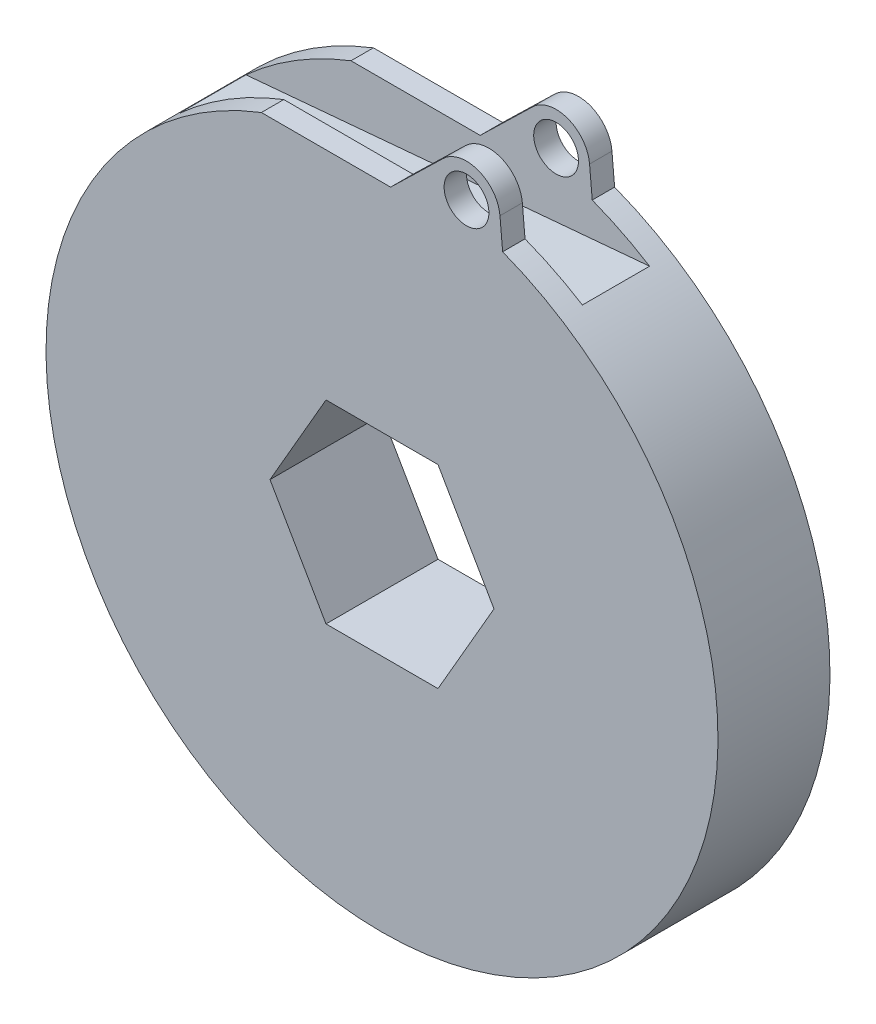
ISO-10303-21;
HEADER;
FILE_DESCRIPTION(('STEP AP214'),'2;1');
FILE_NAME('part.step','',(''),(''),'','','');
FILE_SCHEMA(('AUTOMOTIVE_DESIGN { 1 0 10303 214 1 1 1 1 }'));
ENDSEC;
DATA;
#1=APPLICATION_CONTEXT('core data for automotive mechanical design processes');
#2=APPLICATION_PROTOCOL_DEFINITION('international standard','automotive_design',2000,#1);
#3=PRODUCT_CONTEXT('',#1,'mechanical');
#4=PRODUCT('Part','Part','',(#3));
#5=PRODUCT_RELATED_PRODUCT_CATEGORY('part','',(#4));
#6=PRODUCT_DEFINITION_FORMATION('','',#4);
#7=PRODUCT_DEFINITION_CONTEXT('part definition',#1,'design');
#8=PRODUCT_DEFINITION('design','',#6,#7);
#9=PRODUCT_DEFINITION_SHAPE('','',#8);
#10=(LENGTH_UNIT() NAMED_UNIT(*) SI_UNIT(.MILLI.,.METRE.));
#11=(NAMED_UNIT(*) PLANE_ANGLE_UNIT() SI_UNIT($,.RADIAN.));
#12=(NAMED_UNIT(*) SI_UNIT($,.STERADIAN.) SOLID_ANGLE_UNIT());
#13=UNCERTAINTY_MEASURE_WITH_UNIT(LENGTH_MEASURE(1.E-05),#10,'distance_accuracy_value','');
#14=(GEOMETRIC_REPRESENTATION_CONTEXT(3) GLOBAL_UNCERTAINTY_ASSIGNED_CONTEXT((#13)) GLOBAL_UNIT_ASSIGNED_CONTEXT((#10,
#11,#12)) REPRESENTATION_CONTEXT('',''));
#15=CARTESIAN_POINT('',(0.,0.,0.));
#16=DIRECTION('',(0.,0.,1.));
#17=DIRECTION('',(1.,0.,0.));
#18=AXIS2_PLACEMENT_3D('',#15,#16,#17);
#19=CARTESIAN_POINT('',(-8.5865711114357,14.,-55.));
#20=DIRECTION('',(0.,-1.,0.));
#21=DIRECTION('',(0.,0.,-1.));
#22=AXIS2_PLACEMENT_3D('',#19,#20,#21);
#23=PLANE('',#22);
#24=DIRECTION('',(0.,0.,1.));
#25=VECTOR('',#24,1.);
#26=CARTESIAN_POINT('',(0.385164807134501,14.,-5.68242905807015));
#27=LINE('',#26,#25);
#28=CARTESIAN_POINT('',(0.385164807134501,14.,4.));
#29=VERTEX_POINT('',#28);
#30=CARTESIAN_POINT('',(0.385164807134501,14.,5.));
#31=VERTEX_POINT('',#30);
#32=EDGE_CURVE('E296',#29,#31,#27,.T.);
#33=ORIENTED_EDGE('',*,*,#32,.F.);
#34=DIRECTION('',(-1.,0.,0.));
#35=VECTOR('',#34,1.);
#36=CARTESIAN_POINT('',(-8.5865711114357,14.,4.));
#37=LINE('',#36,#35);
#38=CARTESIAN_POINT('',(-5.3851648071345,14.,4.));
#39=VERTEX_POINT('',#38);
#40=EDGE_CURVE('E271',#29,#39,#37,.T.);
#41=ORIENTED_EDGE('',*,*,#40,.T.);
#42=DIRECTION('',(0.,0.,-1.));
#43=VECTOR('',#42,1.);
#44=CARTESIAN_POINT('',(-5.38516480713451,14.,5.));
#45=LINE('',#44,#43);
#46=CARTESIAN_POINT('',(-5.3851648071345,14.,5.));
#47=VERTEX_POINT('',#46);
#48=EDGE_CURVE('E192',#47,#39,#45,.T.);
#49=ORIENTED_EDGE('',*,*,#48,.F.);
#50=DIRECTION('',(1.,0.,0.));
#51=VECTOR('',#50,1.);
#52=CARTESIAN_POINT('',(-8.5865711114357,14.,5.));
#53=LINE('',#52,#51);
#54=EDGE_CURVE('E184',#47,#31,#53,.T.);
#55=ORIENTED_EDGE('',*,*,#54,.T.);
#56=EDGE_LOOP('',(#33,#41,#49,#55));
#57=FACE_BOUND('',#56,.T.);
#58=ADVANCED_FACE('F33',(#57),#23,.F.);
#59=CARTESIAN_POINT('',(5.3851648071345,14.,-5.68242905807015));
#60=DIRECTION('',(0.996028320712149,0.0890369829864902,0.));
#61=DIRECTION('',(-0.0890369829864902,0.996028320712149,0.));
#62=AXIS2_PLACEMENT_3D('',#59,#60,#61);
#63=PLANE('',#62);
#64=DIRECTION('',(0.0890369829864898,-0.996028320712149,0.));
#65=VECTOR('',#64,1.);
#66=CARTESIAN_POINT('',(4.93637424818433,19.0204767927777,4.));
#67=LINE('',#66,#65);
#68=CARTESIAN_POINT('',(5.26595559026415,15.3335554744797,4.));
#69=VERTEX_POINT('',#68);
#70=CARTESIAN_POINT('',(5.38516480713451,14.,4.));
#71=VERTEX_POINT('',#70);
#72=EDGE_CURVE('E169',#69,#71,#67,.T.);
#73=ORIENTED_EDGE('',*,*,#72,.F.);
#74=DIRECTION('',(0.,0.,1.));
#75=VECTOR('',#74,1.);
#76=CARTESIAN_POINT('',(5.26595559026414,15.3335554744797,-5.68242905807015));
#77=LINE('',#76,#75);
#78=CARTESIAN_POINT('',(5.26595559026414,15.3335554744797,5.));
#79=VERTEX_POINT('',#78);
#80=EDGE_CURVE('E293',#69,#79,#77,.T.);
#81=ORIENTED_EDGE('',*,*,#80,.T.);
#82=DIRECTION('',(-0.0890369829864902,0.996028320712149,0.));
#83=VECTOR('',#82,1.);
#84=CARTESIAN_POINT('',(5.3851648071345,14.,5.));
#85=LINE('',#84,#83);
#86=CARTESIAN_POINT('',(5.3851648071345,14.,5.));
#87=VERTEX_POINT('',#86);
#88=EDGE_CURVE('E182',#87,#79,#85,.T.);
#89=ORIENTED_EDGE('',*,*,#88,.F.);
#90=DIRECTION('',(0.,0.,-1.));
#91=VECTOR('',#90,1.);
#92=CARTESIAN_POINT('',(5.38516480713451,14.,5.));
#93=LINE('',#92,#91);
#94=EDGE_CURVE('E163',#71,#87,#93,.F.);
#95=ORIENTED_EDGE('',*,*,#94,.F.);
#96=EDGE_LOOP('',(#73,#81,#89,#95));
#97=FACE_BOUND('',#96,.T.);
#98=ADVANCED_FACE('F180',(#97),#63,.T.);
#99=CARTESIAN_POINT('',(3.77191310919592,15.2,-5.68242905807015));
#100=DIRECTION('',(0.,0.,1.));
#101=DIRECTION('',(1.,0.,0.));
#102=AXIS2_PLACEMENT_3D('',#99,#100,#101);
#103=CYLINDRICAL_SURFACE('',#102,1.5);
#104=CARTESIAN_POINT('',(3.77191310919592,15.2,4.));
#105=DIRECTION('',(0.,0.,1.));
#106=DIRECTION('',(0.,-1.,0.));
#107=AXIS2_PLACEMENT_3D('',#104,#105,#106);
#108=CIRCLE('',#107,1.5);
#109=CARTESIAN_POINT('',(2.72643887666471,16.275631734895,4.));
#110=VERTEX_POINT('',#109);
#111=EDGE_CURVE('E175',#110,#69,#108,.F.);
#112=ORIENTED_EDGE('',*,*,#111,.F.);
#113=DIRECTION('',(0.,0.,1.));
#114=VECTOR('',#113,1.);
#115=CARTESIAN_POINT('',(2.72643887666471,16.275631734895,-5.68242905807015));
#116=LINE('',#115,#114);
#117=CARTESIAN_POINT('',(2.72643887666471,16.275631734895,5.));
#118=VERTEX_POINT('',#117);
#119=EDGE_CURVE('E300',#110,#118,#116,.T.);
#120=ORIENTED_EDGE('',*,*,#119,.T.);
#121=CARTESIAN_POINT('',(3.77191310919592,15.2,5.));
#122=DIRECTION('',(0.,0.,1.));
#123=DIRECTION('',(1.,0.,0.));
#124=AXIS2_PLACEMENT_3D('',#121,#122,#123);
#125=CIRCLE('',#124,1.5);
#126=EDGE_CURVE('E287',#79,#118,#125,.T.);
#127=ORIENTED_EDGE('',*,*,#126,.F.);
#128=ORIENTED_EDGE('',*,*,#80,.F.);
#129=EDGE_LOOP('',(#112,#120,#127,#128));
#130=FACE_BOUND('',#129,.T.);
#131=ADVANCED_FACE('F332',(#130),#103,.T.);
#132=CARTESIAN_POINT('',(2.72643887666471,16.275631734895,-5.68242905807015));
#133=DIRECTION('',(-0.696982821687471,0.717087823263351,0.));
#134=DIRECTION('',(-0.717087823263351,-0.696982821687471,0.));
#135=AXIS2_PLACEMENT_3D('',#132,#133,#134);
#136=PLANE('',#135);
#137=DIRECTION('',(0.717087823263351,0.696982821687471,0.));
#138=VECTOR('',#137,1.);
#139=CARTESIAN_POINT('',(2.72643887666471,16.275631734895,4.));
#140=LINE('',#139,#138);
#141=EDGE_CURVE('E257',#29,#110,#140,.T.);
#142=ORIENTED_EDGE('',*,*,#141,.F.);
#143=ORIENTED_EDGE('',*,*,#32,.T.);
#144=DIRECTION('',(-0.717087823263351,-0.696982821687471,0.));
#145=VECTOR('',#144,1.);
#146=CARTESIAN_POINT('',(2.72643887666471,16.275631734895,5.));
#147=LINE('',#146,#145);
#148=EDGE_CURVE('E290',#118,#31,#147,.T.);
#149=ORIENTED_EDGE('',*,*,#148,.F.);
#150=ORIENTED_EDGE('',*,*,#119,.F.);
#151=EDGE_LOOP('',(#142,#143,#149,#150));
#152=FACE_BOUND('',#151,.T.);
#153=ADVANCED_FACE('F370',(#152),#136,.T.);
#154=CARTESIAN_POINT('',(3.77191310919592,15.2,-5.68242905807015));
#155=DIRECTION('',(0.,0.,1.));
#156=DIRECTION('',(1.,0.,0.));
#157=AXIS2_PLACEMENT_3D('',#154,#155,#156);
#158=CYLINDRICAL_SURFACE('',#157,1.);
#159=CARTESIAN_POINT('',(3.77191310919592,15.2,4.));
#160=DIRECTION('',(0.,0.,1.));
#161=DIRECTION('',(0.,-1.,0.));
#162=AXIS2_PLACEMENT_3D('',#159,#160,#161);
#163=CIRCLE('',#162,1.);
#164=CARTESIAN_POINT('',(3.77191310919592,14.2,4.));
#165=VERTEX_POINT('',#164);
#166=EDGE_CURVE('E255',#165,#165,#163,.F.);
#167=ORIENTED_EDGE('',*,*,#166,.T.);
#168=EDGE_LOOP('',(#167));
#169=FACE_BOUND('',#168,.T.);
#170=CARTESIAN_POINT('',(3.77191310919592,15.2,5.));
#171=DIRECTION('',(0.,0.,1.));
#172=DIRECTION('',(1.,0.,0.));
#173=AXIS2_PLACEMENT_3D('',#170,#171,#172);
#174=CIRCLE('',#173,1.);
#175=CARTESIAN_POINT('',(4.77191310919592,15.2,5.));
#176=VERTEX_POINT('',#175);
#177=EDGE_CURVE('E276',#176,#176,#174,.T.);
#178=ORIENTED_EDGE('',*,*,#177,.T.);
#179=EDGE_LOOP('',(#178));
#180=FACE_BOUND('',#179,.T.);
#181=ADVANCED_FACE('F380',(#169,#180),#158,.F.);
#182=CARTESIAN_POINT('',(0.,0.,5.));
#183=DIRECTION('',(0.,0.,-1.));
#184=DIRECTION('',(-1.,0.,0.));
#185=AXIS2_PLACEMENT_3D('',#182,#183,#184);
#186=CYLINDRICAL_SURFACE('',#185,15.);
#187=CARTESIAN_POINT('',(0.,0.,3.99999999999999));
#188=DIRECTION('',(0.,0.,1.));
#189=DIRECTION('',(0.,-1.,0.));
#190=AXIS2_PLACEMENT_3D('',#187,#188,#189);
#191=CIRCLE('',#190,15.);
#192=CARTESIAN_POINT('',(-10.0759775223483,11.1119159900141,4.));
#193=VERTEX_POINT('',#192);
#194=EDGE_CURVE('E274',#39,#193,#191,.T.);
#195=ORIENTED_EDGE('',*,*,#194,.T.);
#196=DIRECTION('',(0.,0.,-1.));
#197=VECTOR('',#196,1.);
#198=CARTESIAN_POINT('',(-10.0759775223483,11.1119159900141,5.));
#199=LINE('',#198,#197);
#200=CARTESIAN_POINT('',(-10.0759775223483,11.1119159900141,0.999999999999999));
#201=VERTEX_POINT('',#200);
#202=EDGE_CURVE('E11',#193,#201,#199,.T.);
#203=ORIENTED_EDGE('',*,*,#202,.T.);
#204=CARTESIAN_POINT('',(0.,0.,0.999999999999997));
#205=DIRECTION('',(0.,0.,-1.));
#206=DIRECTION('',(0.,1.,0.));
#207=AXIS2_PLACEMENT_3D('',#204,#205,#206);
#208=CIRCLE('',#207,15.);
#209=CARTESIAN_POINT('',(-5.3851648071345,14.,1.));
#210=VERTEX_POINT('',#209);
#211=EDGE_CURVE('E258',#201,#210,#208,.T.);
#212=ORIENTED_EDGE('',*,*,#211,.T.);
#213=CARTESIAN_POINT('',(-5.3851648071345,14.,0.));
#214=VERTEX_POINT('',#213);
#215=EDGE_CURVE('E186',#210,#214,#45,.T.);
#216=ORIENTED_EDGE('',*,*,#215,.T.);
#217=CARTESIAN_POINT('',(0.,0.,0.));
#218=DIRECTION('',(0.,0.,1.));
#219=DIRECTION('',(1.,0.,0.));
#220=AXIS2_PLACEMENT_3D('',#217,#218,#219);
#221=CIRCLE('',#220,15.);
#222=CARTESIAN_POINT('',(5.3851648071345,14.,0.));
#223=VERTEX_POINT('',#222);
#224=EDGE_CURVE('E215',#214,#223,#221,.T.);
#225=ORIENTED_EDGE('',*,*,#224,.T.);
#226=CARTESIAN_POINT('',(5.38516480713451,14.,0.999999999999999));
#227=VERTEX_POINT('',#226);
#228=EDGE_CURVE('E56',#223,#227,#93,.F.);
#229=ORIENTED_EDGE('',*,*,#228,.T.);
#230=CARTESIAN_POINT('',(0.,0.,0.999999999999999));
#231=DIRECTION('',(0.,0.,-1.));
#232=DIRECTION('',(-1.,0.,0.));
#233=AXIS2_PLACEMENT_3D('',#230,#231,#232);
#234=CIRCLE('',#233,15.);
#235=CARTESIAN_POINT('',(7.94533718161869,12.7228777039783,0.999999999999999));
#236=VERTEX_POINT('',#235);
#237=EDGE_CURVE('E170',#227,#236,#234,.T.);
#238=ORIENTED_EDGE('',*,*,#237,.T.);
#239=DIRECTION('',(0.,0.,-1.));
#240=VECTOR('',#239,1.);
#241=CARTESIAN_POINT('',(7.9453371816187,12.7228777039783,5.));
#242=LINE('',#241,#240);
#243=CARTESIAN_POINT('',(7.94533718161869,12.7228777039783,4.));
#244=VERTEX_POINT('',#243);
#245=EDGE_CURVE('E41',#236,#244,#242,.F.);
#246=ORIENTED_EDGE('',*,*,#245,.T.);
#247=CARTESIAN_POINT('',(0.,0.,4.));
#248=DIRECTION('',(0.,0.,1.));
#249=DIRECTION('',(1.,0.,0.));
#250=AXIS2_PLACEMENT_3D('',#247,#248,#249);
#251=CIRCLE('',#250,15.);
#252=EDGE_CURVE('E159',#244,#71,#251,.T.);
#253=ORIENTED_EDGE('',*,*,#252,.T.);
#254=ORIENTED_EDGE('',*,*,#94,.T.);
#255=CARTESIAN_POINT('',(0.,0.,5.));
#256=DIRECTION('',(0.,0.,1.));
#257=DIRECTION('',(1.,0.,0.));
#258=AXIS2_PLACEMENT_3D('',#255,#256,#257);
#259=CIRCLE('',#258,15.);
#260=EDGE_CURVE('E226',#47,#87,#259,.T.);
#261=ORIENTED_EDGE('',*,*,#260,.F.);
#262=ORIENTED_EDGE('',*,*,#48,.T.);
#263=EDGE_LOOP('',(#195,#203,#212,#216,#225,#229,#238,#246,#253,#254,#261,#262));
#264=FACE_BOUND('',#263,.T.);
#265=ADVANCED_FACE('F35',(#264),#186,.T.);
#266=CARTESIAN_POINT('',(0.,0.,5.));
#267=DIRECTION('',(0.,0.,1.));
#268=DIRECTION('',(1.,0.,0.));
#269=AXIS2_PLACEMENT_3D('',#266,#267,#268);
#270=PLANE('',#269);
#271=ORIENTED_EDGE('',*,*,#54,.F.);
#272=ORIENTED_EDGE('',*,*,#260,.T.);
#273=ORIENTED_EDGE('',*,*,#88,.T.);
#274=ORIENTED_EDGE('',*,*,#126,.T.);
#275=ORIENTED_EDGE('',*,*,#148,.T.);
#276=EDGE_LOOP('',(#271,#272,#273,#274,#275));
#277=FACE_BOUND('',#276,.T.);
#278=DIRECTION('',(0.500000000000001,-0.866025403784438,0.));
#279=VECTOR('',#278,1.);
#280=CARTESIAN_POINT('',(-5.,0.,5.));
#281=LINE('',#280,#279);
#282=CARTESIAN_POINT('',(-5.,0.,5.));
#283=VERTEX_POINT('',#282);
#284=CARTESIAN_POINT('',(-2.5,-4.33012701892219,5.));
#285=VERTEX_POINT('',#284);
#286=EDGE_CURVE('E195',#283,#285,#281,.T.);
#287=ORIENTED_EDGE('',*,*,#286,.F.);
#288=DIRECTION('',(-0.5,-0.866025403784439,0.));
#289=VECTOR('',#288,1.);
#290=CARTESIAN_POINT('',(-2.5,4.33012701892219,5.));
#291=LINE('',#290,#289);
#292=CARTESIAN_POINT('',(-2.5,4.33012701892219,5.));
#293=VERTEX_POINT('',#292);
#294=EDGE_CURVE('E209',#293,#283,#291,.T.);
#295=ORIENTED_EDGE('',*,*,#294,.F.);
#296=DIRECTION('',(-1.,0.,0.));
#297=VECTOR('',#296,1.);
#298=CARTESIAN_POINT('',(2.5,4.3301270189222,5.));
#299=LINE('',#298,#297);
#300=CARTESIAN_POINT('',(2.5,4.3301270189222,5.));
#301=VERTEX_POINT('',#300);
#302=EDGE_CURVE('E206',#301,#293,#299,.T.);
#303=ORIENTED_EDGE('',*,*,#302,.F.);
#304=DIRECTION('',(-0.5,0.866025403784439,0.));
#305=VECTOR('',#304,1.);
#306=CARTESIAN_POINT('',(5.,0.,5.));
#307=LINE('',#306,#305);
#308=CARTESIAN_POINT('',(5.,0.,5.));
#309=VERTEX_POINT('',#308);
#310=EDGE_CURVE('E203',#309,#301,#307,.T.);
#311=ORIENTED_EDGE('',*,*,#310,.F.);
#312=DIRECTION('',(0.5,0.866025403784439,0.));
#313=VECTOR('',#312,1.);
#314=CARTESIAN_POINT('',(2.5,-4.33012701892219,5.));
#315=LINE('',#314,#313);
#316=CARTESIAN_POINT('',(2.5,-4.33012701892219,5.));
#317=VERTEX_POINT('',#316);
#318=EDGE_CURVE('E200',#317,#309,#315,.T.);
#319=ORIENTED_EDGE('',*,*,#318,.F.);
#320=DIRECTION('',(1.,0.,0.));
#321=VECTOR('',#320,1.);
#322=CARTESIAN_POINT('',(-2.5,-4.33012701892219,5.));
#323=LINE('',#322,#321);
#324=EDGE_CURVE('E197',#285,#317,#323,.T.);
#325=ORIENTED_EDGE('',*,*,#324,.F.);
#326=EDGE_LOOP('',(#287,#295,#303,#311,#319,#325));
#327=FACE_BOUND('',#326,.T.);
#328=ORIENTED_EDGE('',*,*,#177,.F.);
#329=EDGE_LOOP('',(#328));
#330=FACE_BOUND('',#329,.T.);
#331=ADVANCED_FACE('F311',(#277,#327,#330),#270,.T.);
#332=CARTESIAN_POINT('',(0.,0.,0.));
#333=DIRECTION('',(0.,0.,1.));
#334=DIRECTION('',(1.,0.,0.));
#335=AXIS2_PLACEMENT_3D('',#332,#333,#334);
#336=PLANE('',#335);
#337=DIRECTION('',(-0.5,-0.866025403784439,0.));
#338=VECTOR('',#337,1.);
#339=CARTESIAN_POINT('',(-3.75,2.1650635094611,0.));
#340=LINE('',#339,#338);
#341=CARTESIAN_POINT('',(-2.5,4.33012701892219,0.));
#342=VERTEX_POINT('',#341);
#343=CARTESIAN_POINT('',(-5.,0.,0.));
#344=VERTEX_POINT('',#343);
#345=EDGE_CURVE('E242',#342,#344,#340,.T.);
#346=ORIENTED_EDGE('',*,*,#345,.T.);
#347=DIRECTION('',(0.500000000000001,-0.866025403784438,0.));
#348=VECTOR('',#347,1.);
#349=CARTESIAN_POINT('',(-3.75,-2.1650635094611,0.));
#350=LINE('',#349,#348);
#351=CARTESIAN_POINT('',(-2.5,-4.33012701892219,0.));
#352=VERTEX_POINT('',#351);
#353=EDGE_CURVE('E245',#344,#352,#350,.T.);
#354=ORIENTED_EDGE('',*,*,#353,.T.);
#355=DIRECTION('',(1.,0.,0.));
#356=VECTOR('',#355,1.);
#357=CARTESIAN_POINT('',(0.,-4.33012701892219,0.));
#358=LINE('',#357,#356);
#359=CARTESIAN_POINT('',(2.5,-4.33012701892219,0.));
#360=VERTEX_POINT('',#359);
#361=EDGE_CURVE('E228',#352,#360,#358,.T.);
#362=ORIENTED_EDGE('',*,*,#361,.T.);
#363=DIRECTION('',(0.5,0.866025403784439,0.));
#364=VECTOR('',#363,1.);
#365=CARTESIAN_POINT('',(3.75,-2.16506350946109,0.));
#366=LINE('',#365,#364);
#367=CARTESIAN_POINT('',(5.,0.,0.));
#368=VERTEX_POINT('',#367);
#369=EDGE_CURVE('E233',#360,#368,#366,.T.);
#370=ORIENTED_EDGE('',*,*,#369,.T.);
#371=DIRECTION('',(-0.5,0.866025403784439,0.));
#372=VECTOR('',#371,1.);
#373=CARTESIAN_POINT('',(3.75,2.1650635094611,0.));
#374=LINE('',#373,#372);
#375=CARTESIAN_POINT('',(2.5,4.3301270189222,0.));
#376=VERTEX_POINT('',#375);
#377=EDGE_CURVE('E236',#368,#376,#374,.T.);
#378=ORIENTED_EDGE('',*,*,#377,.T.);
#379=DIRECTION('',(-1.,0.,0.));
#380=VECTOR('',#379,1.);
#381=CARTESIAN_POINT('',(0.,4.3301270189222,0.));
#382=LINE('',#381,#380);
#383=EDGE_CURVE('E239',#376,#342,#382,.T.);
#384=ORIENTED_EDGE('',*,*,#383,.T.);
#385=EDGE_LOOP('',(#346,#354,#362,#370,#378,#384));
#386=FACE_BOUND('',#385,.T.);
#387=ORIENTED_EDGE('',*,*,#224,.F.);
#388=DIRECTION('',(1.,0.,0.));
#389=VECTOR('',#388,1.);
#390=CARTESIAN_POINT('',(0.,14.,0.));
#391=LINE('',#390,#389);
#392=CARTESIAN_POINT('',(0.385164807134501,14.,0.));
#393=VERTEX_POINT('',#392);
#394=EDGE_CURVE('E248',#214,#393,#391,.T.);
#395=ORIENTED_EDGE('',*,*,#394,.T.);
#396=DIRECTION('',(0.717087823263351,0.696982821687471,0.));
#397=VECTOR('',#396,1.);
#398=CARTESIAN_POINT('',(2.72643887666471,16.275631734895,0.));
#399=LINE('',#398,#397);
#400=CARTESIAN_POINT('',(2.72643887666471,16.275631734895,0.));
#401=VERTEX_POINT('',#400);
#402=EDGE_CURVE('E279',#393,#401,#399,.T.);
#403=ORIENTED_EDGE('',*,*,#402,.T.);
#404=CARTESIAN_POINT('',(3.77191310919592,15.2,0.));
#405=DIRECTION('',(0.,0.,1.));
#406=DIRECTION('',(1.,0.,0.));
#407=AXIS2_PLACEMENT_3D('',#404,#405,#406);
#408=CIRCLE('',#407,1.5);
#409=CARTESIAN_POINT('',(5.26595559026414,15.3335554744797,0.));
#410=VERTEX_POINT('',#409);
#411=EDGE_CURVE('E280',#401,#410,#408,.F.);
#412=ORIENTED_EDGE('',*,*,#411,.T.);
#413=DIRECTION('',(0.0890369829864902,-0.996028320712149,0.));
#414=VECTOR('',#413,1.);
#415=CARTESIAN_POINT('',(5.3851648071345,14.,0.));
#416=LINE('',#415,#414);
#417=EDGE_CURVE('E277',#410,#223,#416,.T.);
#418=ORIENTED_EDGE('',*,*,#417,.T.);
#419=EDGE_LOOP('',(#387,#395,#403,#412,#418));
#420=FACE_BOUND('',#419,.T.);
#421=CARTESIAN_POINT('',(3.77191310919592,15.2,0.));
#422=DIRECTION('',(0.,0.,1.));
#423=DIRECTION('',(1.,0.,0.));
#424=AXIS2_PLACEMENT_3D('',#421,#422,#423);
#425=CIRCLE('',#424,1.);
#426=CARTESIAN_POINT('',(4.77191310919592,15.2,0.));
#427=VERTEX_POINT('',#426);
#428=EDGE_CURVE('E188',#427,#427,#425,.F.);
#429=ORIENTED_EDGE('',*,*,#428,.F.);
#430=EDGE_LOOP('',(#429));
#431=FACE_BOUND('',#430,.T.);
#432=ADVANCED_FACE('F308',(#386,#420,#431),#336,.F.);
#433=CARTESIAN_POINT('',(-5.,0.,-25.));
#434=DIRECTION('',(-0.866025403784438,-0.500000000000001,0.));
#435=DIRECTION('',(0.500000000000001,-0.866025403784438,0.));
#436=AXIS2_PLACEMENT_3D('',#433,#434,#435);
#437=PLANE('',#436);
#438=DIRECTION('',(0.,0.,1.));
#439=VECTOR('',#438,1.);
#440=CARTESIAN_POINT('',(-5.,0.,-25.));
#441=LINE('',#440,#439);
#442=EDGE_CURVE('E213',#344,#283,#441,.T.);
#443=ORIENTED_EDGE('',*,*,#442,.T.);
#444=ORIENTED_EDGE('',*,*,#286,.T.);
#445=DIRECTION('',(0.,0.,1.));
#446=VECTOR('',#445,1.);
#447=CARTESIAN_POINT('',(-2.5,-4.33012701892219,-25.));
#448=LINE('',#447,#446);
#449=EDGE_CURVE('E212',#352,#285,#448,.T.);
#450=ORIENTED_EDGE('',*,*,#449,.F.);
#451=ORIENTED_EDGE('',*,*,#353,.F.);
#452=EDGE_LOOP('',(#443,#444,#450,#451));
#453=FACE_BOUND('',#452,.T.);
#454=ADVANCED_FACE('F310',(#453),#437,.F.);
#455=CARTESIAN_POINT('',(-2.5,4.33012701892219,-25.));
#456=DIRECTION('',(-0.866025403784439,0.5,0.));
#457=DIRECTION('',(-0.5,-0.866025403784439,0.));
#458=AXIS2_PLACEMENT_3D('',#455,#456,#457);
#459=PLANE('',#458);
#460=DIRECTION('',(0.,0.,1.));
#461=VECTOR('',#460,1.);
#462=CARTESIAN_POINT('',(-2.5,4.33012701892219,-25.));
#463=LINE('',#462,#461);
#464=EDGE_CURVE('E216',#342,#293,#463,.T.);
#465=ORIENTED_EDGE('',*,*,#464,.T.);
#466=ORIENTED_EDGE('',*,*,#294,.T.);
#467=ORIENTED_EDGE('',*,*,#442,.F.);
#468=ORIENTED_EDGE('',*,*,#345,.F.);
#469=EDGE_LOOP('',(#465,#466,#467,#468));
#470=FACE_BOUND('',#469,.T.);
#471=ADVANCED_FACE('F318',(#470),#459,.F.);
#472=CARTESIAN_POINT('',(2.5,4.3301270189222,-25.));
#473=DIRECTION('',(0.,1.,0.));
#474=DIRECTION('',(-1.,0.,0.));
#475=AXIS2_PLACEMENT_3D('',#472,#473,#474);
#476=PLANE('',#475);
#477=DIRECTION('',(0.,0.,1.));
#478=VECTOR('',#477,1.);
#479=CARTESIAN_POINT('',(2.5,4.3301270189222,-25.));
#480=LINE('',#479,#478);
#481=EDGE_CURVE('E218',#376,#301,#480,.T.);
#482=ORIENTED_EDGE('',*,*,#481,.T.);
#483=ORIENTED_EDGE('',*,*,#302,.T.);
#484=ORIENTED_EDGE('',*,*,#464,.F.);
#485=ORIENTED_EDGE('',*,*,#383,.F.);
#486=EDGE_LOOP('',(#482,#483,#484,#485));
#487=FACE_BOUND('',#486,.T.);
#488=ADVANCED_FACE('F503',(#487),#476,.F.);
#489=CARTESIAN_POINT('',(5.,0.,-25.));
#490=DIRECTION('',(0.866025403784439,0.5,0.));
#491=DIRECTION('',(-0.5,0.866025403784439,0.));
#492=AXIS2_PLACEMENT_3D('',#489,#490,#491);
#493=PLANE('',#492);
#494=DIRECTION('',(0.,0.,1.));
#495=VECTOR('',#494,1.);
#496=CARTESIAN_POINT('',(5.,0.,-25.));
#497=LINE('',#496,#495);
#498=EDGE_CURVE('E220',#368,#309,#497,.T.);
#499=ORIENTED_EDGE('',*,*,#498,.T.);
#500=ORIENTED_EDGE('',*,*,#310,.T.);
#501=ORIENTED_EDGE('',*,*,#481,.F.);
#502=ORIENTED_EDGE('',*,*,#377,.F.);
#503=EDGE_LOOP('',(#499,#500,#501,#502));
#504=FACE_BOUND('',#503,.T.);
#505=ADVANCED_FACE('F493',(#504),#493,.F.);
#506=CARTESIAN_POINT('',(2.5,-4.33012701892219,-25.));
#507=DIRECTION('',(0.866025403784439,-0.499999999999999,0.));
#508=DIRECTION('',(0.5,0.866025403784439,0.));
#509=AXIS2_PLACEMENT_3D('',#506,#507,#508);
#510=PLANE('',#509);
#511=DIRECTION('',(0.,0.,1.));
#512=VECTOR('',#511,1.);
#513=CARTESIAN_POINT('',(2.5,-4.33012701892219,-25.));
#514=LINE('',#513,#512);
#515=EDGE_CURVE('E222',#360,#317,#514,.T.);
#516=ORIENTED_EDGE('',*,*,#515,.T.);
#517=ORIENTED_EDGE('',*,*,#318,.T.);
#518=ORIENTED_EDGE('',*,*,#498,.F.);
#519=ORIENTED_EDGE('',*,*,#369,.F.);
#520=EDGE_LOOP('',(#516,#517,#518,#519));
#521=FACE_BOUND('',#520,.T.);
#522=ADVANCED_FACE('F343',(#521),#510,.F.);
#523=CARTESIAN_POINT('',(-2.5,-4.33012701892219,-25.));
#524=DIRECTION('',(0.,-1.,0.));
#525=DIRECTION('',(0.,0.,-1.));
#526=AXIS2_PLACEMENT_3D('',#523,#524,#525);
#527=PLANE('',#526);
#528=ORIENTED_EDGE('',*,*,#449,.T.);
#529=ORIENTED_EDGE('',*,*,#324,.T.);
#530=ORIENTED_EDGE('',*,*,#515,.F.);
#531=ORIENTED_EDGE('',*,*,#361,.F.);
#532=EDGE_LOOP('',(#528,#529,#530,#531));
#533=FACE_BOUND('',#532,.T.);
#534=ADVANCED_FACE('F337',(#533),#527,.F.);
#535=ORIENTED_EDGE('',*,*,#215,.F.);
#536=DIRECTION('',(1.,0.,0.));
#537=VECTOR('',#536,1.);
#538=CARTESIAN_POINT('',(-8.5865711114357,14.,1.));
#539=LINE('',#538,#537);
#540=CARTESIAN_POINT('',(0.385164807134501,14.,1.));
#541=VERTEX_POINT('',#540);
#542=EDGE_CURVE('E263',#210,#541,#539,.T.);
#543=ORIENTED_EDGE('',*,*,#542,.T.);
#544=EDGE_CURVE('E282',#393,#541,#27,.T.);
#545=ORIENTED_EDGE('',*,*,#544,.F.);
#546=ORIENTED_EDGE('',*,*,#394,.F.);
#547=EDGE_LOOP('',(#535,#543,#545,#546));
#548=FACE_BOUND('',#547,.T.);
#549=ADVANCED_FACE('F327',(#548),#23,.F.);
#550=DIRECTION('',(-0.0890369829864898,0.996028320712149,0.));
#551=VECTOR('',#550,1.);
#552=CARTESIAN_POINT('',(4.93637424818433,19.0204767927777,1.));
#553=LINE('',#552,#551);
#554=CARTESIAN_POINT('',(5.26595559026415,15.3335554744797,1.));
#555=VERTEX_POINT('',#554);
#556=EDGE_CURVE('E178',#227,#555,#553,.T.);
#557=ORIENTED_EDGE('',*,*,#556,.F.);
#558=ORIENTED_EDGE('',*,*,#228,.F.);
#559=ORIENTED_EDGE('',*,*,#417,.F.);
#560=EDGE_CURVE('E301',#410,#555,#77,.T.);
#561=ORIENTED_EDGE('',*,*,#560,.T.);
#562=EDGE_LOOP('',(#557,#558,#559,#561));
#563=FACE_BOUND('',#562,.T.);
#564=ADVANCED_FACE('F334',(#563),#63,.T.);
#565=CARTESIAN_POINT('',(3.77191310919592,15.2,0.999999999999999));
#566=DIRECTION('',(0.,0.,-1.));
#567=DIRECTION('',(0.,1.,0.));
#568=AXIS2_PLACEMENT_3D('',#565,#566,#567);
#569=CIRCLE('',#568,1.5);
#570=CARTESIAN_POINT('',(2.72643887666471,16.275631734895,1.));
#571=VERTEX_POINT('',#570);
#572=EDGE_CURVE('E48',#555,#571,#569,.F.);
#573=ORIENTED_EDGE('',*,*,#572,.F.);
#574=ORIENTED_EDGE('',*,*,#560,.F.);
#575=ORIENTED_EDGE('',*,*,#411,.F.);
#576=EDGE_CURVE('E297',#401,#571,#116,.T.);
#577=ORIENTED_EDGE('',*,*,#576,.T.);
#578=EDGE_LOOP('',(#573,#574,#575,#577));
#579=FACE_BOUND('',#578,.T.);
#580=ADVANCED_FACE('F342',(#579),#103,.T.);
#581=DIRECTION('',(-0.717087823263351,-0.696982821687471,0.));
#582=VECTOR('',#581,1.);
#583=CARTESIAN_POINT('',(2.72643887666471,16.275631734895,1.));
#584=LINE('',#583,#582);
#585=EDGE_CURVE('E254',#571,#541,#584,.T.);
#586=ORIENTED_EDGE('',*,*,#585,.F.);
#587=ORIENTED_EDGE('',*,*,#576,.F.);
#588=ORIENTED_EDGE('',*,*,#402,.F.);
#589=ORIENTED_EDGE('',*,*,#544,.T.);
#590=EDGE_LOOP('',(#586,#587,#588,#589));
#591=FACE_BOUND('',#590,.T.);
#592=ADVANCED_FACE('F382',(#591),#136,.T.);
#593=CARTESIAN_POINT('',(3.77191310919592,15.2,0.999999999999999));
#594=DIRECTION('',(0.,0.,-1.));
#595=DIRECTION('',(0.,1.,0.));
#596=AXIS2_PLACEMENT_3D('',#593,#594,#595);
#597=CIRCLE('',#596,1.);
#598=CARTESIAN_POINT('',(3.77191310919592,16.2,0.999999999999999));
#599=VERTEX_POINT('',#598);
#600=EDGE_CURVE('E251',#599,#599,#597,.F.);
#601=ORIENTED_EDGE('',*,*,#600,.T.);
#602=EDGE_LOOP('',(#601));
#603=FACE_BOUND('',#602,.T.);
#604=ORIENTED_EDGE('',*,*,#428,.T.);
#605=EDGE_LOOP('',(#604));
#606=FACE_BOUND('',#605,.T.);
#607=ADVANCED_FACE('F306',(#603,#606),#158,.F.);
#608=CARTESIAN_POINT('',(-17.8590027883843,16.9827520060724,4.));
#609=DIRECTION('',(0.,0.,1.));
#610=DIRECTION('',(0.,-1.,0.));
#611=AXIS2_PLACEMENT_3D('',#608,#609,#610);
#612=PLANE('',#611);
#613=ORIENTED_EDGE('',*,*,#166,.F.);
#614=EDGE_LOOP('',(#613));
#615=FACE_BOUND('',#614,.T.);
#616=ORIENTED_EDGE('',*,*,#40,.F.);
#617=ORIENTED_EDGE('',*,*,#141,.T.);
#618=ORIENTED_EDGE('',*,*,#111,.T.);
#619=ORIENTED_EDGE('',*,*,#72,.T.);
#620=ORIENTED_EDGE('',*,*,#252,.F.);
#621=DIRECTION('',(0.996028320712149,0.0890369829864902,0.));
#622=VECTOR('',#621,1.);
#623=CARTESIAN_POINT('',(-17.2766567549544,10.4682327322265,4.));
#624=LINE('',#623,#622);
#625=EDGE_CURVE('E358',#193,#244,#624,.T.);
#626=ORIENTED_EDGE('',*,*,#625,.F.);
#627=ORIENTED_EDGE('',*,*,#194,.F.);
#628=EDGE_LOOP('',(#616,#617,#618,#619,#620,#626,#627));
#629=FACE_BOUND('',#628,.T.);
#630=ADVANCED_FACE('F173',(#615,#629),#612,.F.);
#631=CARTESIAN_POINT('',(-17.8590027883843,16.9827520060724,1.));
#632=DIRECTION('',(0.,0.,-1.));
#633=DIRECTION('',(0.,1.,0.));
#634=AXIS2_PLACEMENT_3D('',#631,#632,#633);
#635=PLANE('',#634);
#636=ORIENTED_EDGE('',*,*,#600,.F.);
#637=EDGE_LOOP('',(#636));
#638=FACE_BOUND('',#637,.T.);
#639=ORIENTED_EDGE('',*,*,#211,.F.);
#640=DIRECTION('',(0.996028320712149,0.0890369829864902,0.));
#641=VECTOR('',#640,1.);
#642=CARTESIAN_POINT('',(-17.2766567549544,10.4682327322265,0.999999999999999));
#643=LINE('',#642,#641);
#644=EDGE_CURVE('E357',#201,#236,#643,.T.);
#645=ORIENTED_EDGE('',*,*,#644,.T.);
#646=ORIENTED_EDGE('',*,*,#237,.F.);
#647=ORIENTED_EDGE('',*,*,#556,.T.);
#648=ORIENTED_EDGE('',*,*,#572,.T.);
#649=ORIENTED_EDGE('',*,*,#585,.T.);
#650=ORIENTED_EDGE('',*,*,#542,.F.);
#651=EDGE_LOOP('',(#639,#645,#646,#647,#648,#649,#650));
#652=FACE_BOUND('',#651,.T.);
#653=ADVANCED_FACE('F362',(#638,#652),#635,.F.);
#654=CARTESIAN_POINT('',(-17.2766567549544,10.4682327322265,4.));
#655=DIRECTION('',(0.0890369829864902,-0.996028320712149,0.));
#656=DIRECTION('',(0.996028320712149,0.0890369829864902,0.));
#657=AXIS2_PLACEMENT_3D('',#654,#655,#656);
#658=PLANE('',#657);
#659=ORIENTED_EDGE('',*,*,#625,.T.);
#660=ORIENTED_EDGE('',*,*,#245,.F.);
#661=ORIENTED_EDGE('',*,*,#644,.F.);
#662=ORIENTED_EDGE('',*,*,#202,.F.);
#663=EDGE_LOOP('',(#659,#660,#661,#662));
#664=FACE_BOUND('',#663,.T.);
#665=ADVANCED_FACE('F365',(#664),#658,.F.);
#666=CLOSED_SHELL('',(#58,#98,#131,#153,#181,#265,#331,#432,#454,#471,#488,#505,#522,#534,#549,
#564,#580,#592,#607,#630,#653,#665));
#667=MANIFOLD_SOLID_BREP('B2',#666);
#668=ADVANCED_BREP_SHAPE_REPRESENTATION('',(#18,#667),#14);
#669=SHAPE_DEFINITION_REPRESENTATION(#9,#668);
ENDSEC;
END-ISO-10303-21;
